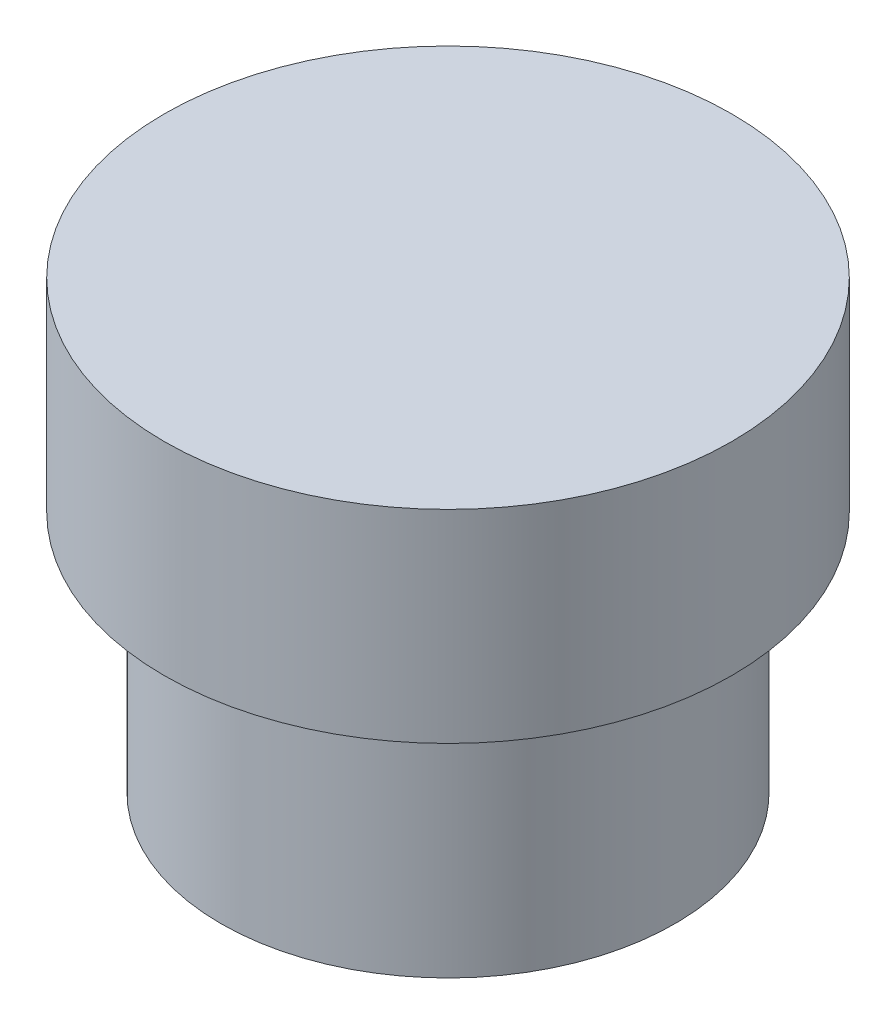
ISO-10303-21;
HEADER;
FILE_DESCRIPTION(('STEP AP214'),'2;1');
FILE_NAME('part.step','',(''),(''),'','','');
FILE_SCHEMA(('AUTOMOTIVE_DESIGN { 1 0 10303 214 1 1 1 1 }'));
ENDSEC;
DATA;
#1=APPLICATION_CONTEXT('core data for automotive mechanical design processes');
#2=APPLICATION_PROTOCOL_DEFINITION('international standard','automotive_design',2000,#1);
#3=PRODUCT_CONTEXT('',#1,'mechanical');
#4=PRODUCT('Part','Part','',(#3));
#5=PRODUCT_RELATED_PRODUCT_CATEGORY('part','',(#4));
#6=PRODUCT_DEFINITION_FORMATION('','',#4);
#7=PRODUCT_DEFINITION_CONTEXT('part definition',#1,'design');
#8=PRODUCT_DEFINITION('design','',#6,#7);
#9=PRODUCT_DEFINITION_SHAPE('','',#8);
#10=(LENGTH_UNIT() NAMED_UNIT(*) SI_UNIT(.MILLI.,.METRE.));
#11=(NAMED_UNIT(*) PLANE_ANGLE_UNIT() SI_UNIT($,.RADIAN.));
#12=(NAMED_UNIT(*) SI_UNIT($,.STERADIAN.) SOLID_ANGLE_UNIT());
#13=UNCERTAINTY_MEASURE_WITH_UNIT(LENGTH_MEASURE(1.E-05),#10,'distance_accuracy_value','');
#14=(GEOMETRIC_REPRESENTATION_CONTEXT(3) GLOBAL_UNCERTAINTY_ASSIGNED_CONTEXT((#13)) GLOBAL_UNIT_ASSIGNED_CONTEXT((#10,
#11,#12)) REPRESENTATION_CONTEXT('',''));
#15=CARTESIAN_POINT('',(0.,0.,0.));
#16=DIRECTION('',(0.,0.,1.));
#17=DIRECTION('',(1.,0.,0.));
#18=AXIS2_PLACEMENT_3D('',#15,#16,#17);
#19=CARTESIAN_POINT('',(0.,0.,0.));
#20=DIRECTION('',(0.,1.,0.));
#21=DIRECTION('',(0.,0.,1.));
#22=AXIS2_PLACEMENT_3D('',#19,#20,#21);
#23=PLANE('',#22);
#24=CARTESIAN_POINT('',(0.,0.,0.));
#25=DIRECTION('',(0.,1.,0.));
#26=DIRECTION('',(0.,0.,1.));
#27=AXIS2_PLACEMENT_3D('',#24,#25,#26);
#28=CIRCLE('',#27,5.60000000000001);
#29=CARTESIAN_POINT('',(0.,0.,5.60000000000001));
#30=VERTEX_POINT('',#29);
#31=EDGE_CURVE('E10',#30,#30,#28,.T.);
#32=ORIENTED_EDGE('',*,*,#31,.F.);
#33=EDGE_LOOP('',(#32));
#34=FACE_BOUND('',#33,.T.);
#35=ADVANCED_FACE('F37',(#34),#23,.F.);
#36=CARTESIAN_POINT('',(0.,56.5548294294556,0.));
#37=DIRECTION('',(0.,1.,0.));
#38=DIRECTION('',(0.,0.,1.));
#39=AXIS2_PLACEMENT_3D('',#36,#37,#38);
#40=CYLINDRICAL_SURFACE('',#39,5.60000000000001);
#41=CARTESIAN_POINT('',(0.,6.,0.));
#42=DIRECTION('',(0.,1.,0.));
#43=DIRECTION('',(0.,0.,1.));
#44=AXIS2_PLACEMENT_3D('',#41,#42,#43);
#45=CIRCLE('',#44,5.60000000000001);
#46=CARTESIAN_POINT('',(0.,6.,5.60000000000001));
#47=VERTEX_POINT('',#46);
#48=EDGE_CURVE('E43',#47,#47,#45,.T.);
#49=ORIENTED_EDGE('',*,*,#48,.F.);
#50=EDGE_LOOP('',(#49));
#51=FACE_BOUND('',#50,.T.);
#52=ORIENTED_EDGE('',*,*,#31,.T.);
#53=EDGE_LOOP('',(#52));
#54=FACE_BOUND('',#53,.T.);
#55=ADVANCED_FACE('F67',(#51,#54),#40,.T.);
#56=CARTESIAN_POINT('',(5.60000000000001,6.,0.));
#57=DIRECTION('',(0.,1.,0.));
#58=DIRECTION('',(0.,0.,1.));
#59=AXIS2_PLACEMENT_3D('',#56,#57,#58);
#60=PLANE('',#59);
#61=CARTESIAN_POINT('',(0.,6.,0.));
#62=DIRECTION('',(0.,1.,0.));
#63=DIRECTION('',(0.,0.,1.));
#64=AXIS2_PLACEMENT_3D('',#61,#62,#63);
#65=CIRCLE('',#64,7.);
#66=CARTESIAN_POINT('',(0.,6.,7.));
#67=VERTEX_POINT('',#66);
#68=EDGE_CURVE('E47',#67,#67,#65,.T.);
#69=ORIENTED_EDGE('',*,*,#68,.F.);
#70=EDGE_LOOP('',(#69));
#71=FACE_BOUND('',#70,.T.);
#72=ORIENTED_EDGE('',*,*,#48,.T.);
#73=EDGE_LOOP('',(#72));
#74=FACE_BOUND('',#73,.T.);
#75=ADVANCED_FACE('F62',(#71,#74),#60,.F.);
#76=CARTESIAN_POINT('',(0.,56.5548294294556,0.));
#77=DIRECTION('',(0.,1.,0.));
#78=DIRECTION('',(0.,0.,1.));
#79=AXIS2_PLACEMENT_3D('',#76,#77,#78);
#80=CYLINDRICAL_SURFACE('',#79,7.);
#81=CARTESIAN_POINT('',(0.,11.,0.));
#82=DIRECTION('',(0.,1.,0.));
#83=DIRECTION('',(0.,0.,1.));
#84=AXIS2_PLACEMENT_3D('',#81,#82,#83);
#85=CIRCLE('',#84,7.00000000000001);
#86=CARTESIAN_POINT('',(0.,11.,7.00000000000001));
#87=VERTEX_POINT('',#86);
#88=EDGE_CURVE('E51',#87,#87,#85,.T.);
#89=ORIENTED_EDGE('',*,*,#88,.F.);
#90=EDGE_LOOP('',(#89));
#91=FACE_BOUND('',#90,.T.);
#92=ORIENTED_EDGE('',*,*,#68,.T.);
#93=EDGE_LOOP('',(#92));
#94=FACE_BOUND('',#93,.T.);
#95=ADVANCED_FACE('F59',(#91,#94),#80,.T.);
#96=CARTESIAN_POINT('',(7.00000000000001,11.,0.));
#97=DIRECTION('',(0.,-1.,0.));
#98=DIRECTION('',(0.,0.,-1.));
#99=AXIS2_PLACEMENT_3D('',#96,#97,#98);
#100=PLANE('',#99);
#101=ORIENTED_EDGE('',*,*,#88,.T.);
#102=EDGE_LOOP('',(#101));
#103=FACE_BOUND('',#102,.T.);
#104=ADVANCED_FACE('F57',(#103),#100,.F.);
#105=CLOSED_SHELL('',(#35,#55,#75,#95,#104));
#106=MANIFOLD_SOLID_BREP('B2',#105);
#107=ADVANCED_BREP_SHAPE_REPRESENTATION('',(#18,#106),#14);
#108=SHAPE_DEFINITION_REPRESENTATION(#9,#107);
ENDSEC;
END-ISO-10303-21;
